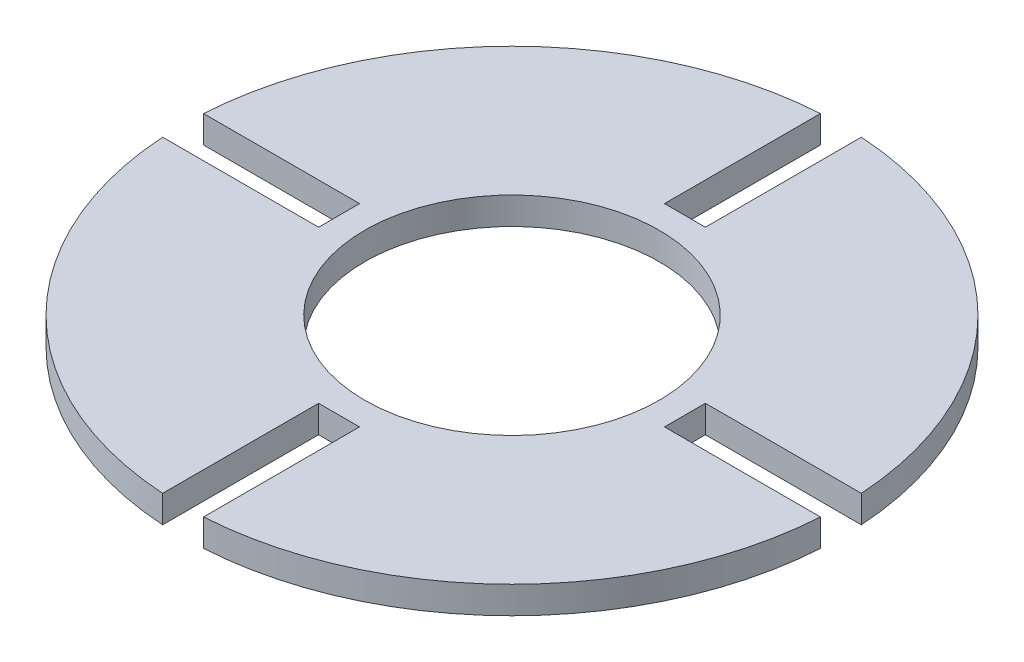
ISO-10303-21;
HEADER;
FILE_DESCRIPTION(('STEP AP214'),'2;1');
FILE_NAME('part.step','',(''),(''),'','','');
FILE_SCHEMA(('AUTOMOTIVE_DESIGN { 1 0 10303 214 1 1 1 1 }'));
ENDSEC;
DATA;
#1=APPLICATION_CONTEXT('core data for automotive mechanical design processes');
#2=APPLICATION_PROTOCOL_DEFINITION('international standard','automotive_design',2000,#1);
#3=PRODUCT_CONTEXT('',#1,'mechanical');
#4=PRODUCT('Part','Part','',(#3));
#5=PRODUCT_RELATED_PRODUCT_CATEGORY('part','',(#4));
#6=PRODUCT_DEFINITION_FORMATION('','',#4);
#7=PRODUCT_DEFINITION_CONTEXT('part definition',#1,'design');
#8=PRODUCT_DEFINITION('design','',#6,#7);
#9=PRODUCT_DEFINITION_SHAPE('','',#8);
#10=(LENGTH_UNIT() NAMED_UNIT(*) SI_UNIT(.MILLI.,.METRE.));
#11=(NAMED_UNIT(*) PLANE_ANGLE_UNIT() SI_UNIT($,.RADIAN.));
#12=(NAMED_UNIT(*) SI_UNIT($,.STERADIAN.) SOLID_ANGLE_UNIT());
#13=UNCERTAINTY_MEASURE_WITH_UNIT(LENGTH_MEASURE(1.E-05),#10,'distance_accuracy_value','');
#14=(GEOMETRIC_REPRESENTATION_CONTEXT(3) GLOBAL_UNCERTAINTY_ASSIGNED_CONTEXT((#13)) GLOBAL_UNIT_ASSIGNED_CONTEXT((#10,
#11,#12)) REPRESENTATION_CONTEXT('',''));
#15=CARTESIAN_POINT('',(0.,0.,0.));
#16=DIRECTION('',(0.,0.,1.));
#17=DIRECTION('',(1.,0.,0.));
#18=AXIS2_PLACEMENT_3D('',#15,#16,#17);
#19=CARTESIAN_POINT('',(0.,2.,0.));
#20=DIRECTION('',(0.,1.,0.));
#21=DIRECTION('',(0.,0.,1.));
#22=AXIS2_PLACEMENT_3D('',#19,#20,#21);
#23=PLANE('',#22);
#24=CARTESIAN_POINT('',(0.,2.,0.));
#25=DIRECTION('',(0.,1.,0.));
#26=DIRECTION('',(0.,0.,1.));
#27=AXIS2_PLACEMENT_3D('',#24,#25,#26);
#28=CIRCLE('',#27,24.15);
#29=CARTESIAN_POINT('',(-1.5,2.,-24.1033711335157));
#30=VERTEX_POINT('',#29);
#31=CARTESIAN_POINT('',(-24.1033711335157,2.,-1.5));
#32=VERTEX_POINT('',#31);
#33=EDGE_CURVE('E236',#30,#32,#28,.T.);
#34=ORIENTED_EDGE('',*,*,#33,.T.);
#35=DIRECTION('',(1.,0.,0.));
#36=VECTOR('',#35,1.);
#37=CARTESIAN_POINT('',(-12.6733711335157,2.,-1.5));
#38=LINE('',#37,#36);
#39=CARTESIAN_POINT('',(-12.6733711335157,2.,-1.5));
#40=VERTEX_POINT('',#39);
#41=EDGE_CURVE('E124',#32,#40,#38,.T.);
#42=ORIENTED_EDGE('',*,*,#41,.T.);
#43=DIRECTION('',(0.,0.,1.));
#44=VECTOR('',#43,1.);
#45=CARTESIAN_POINT('',(-12.6733711335157,2.,1.5));
#46=LINE('',#45,#44);
#47=CARTESIAN_POINT('',(-12.6733711335157,2.,1.5));
#48=VERTEX_POINT('',#47);
#49=EDGE_CURVE('E289',#40,#48,#46,.T.);
#50=ORIENTED_EDGE('',*,*,#49,.T.);
#51=DIRECTION('',(-1.,0.,0.));
#52=VECTOR('',#51,1.);
#53=CARTESIAN_POINT('',(-24.1033711335157,2.,1.50000000000001));
#54=LINE('',#53,#52);
#55=CARTESIAN_POINT('',(-24.1033711335157,2.,1.5));
#56=VERTEX_POINT('',#55);
#57=EDGE_CURVE('E309',#48,#56,#54,.T.);
#58=ORIENTED_EDGE('',*,*,#57,.T.);
#59=CARTESIAN_POINT('',(0.,2.,0.));
#60=DIRECTION('',(0.,1.,0.));
#61=DIRECTION('',(0.,0.,1.));
#62=AXIS2_PLACEMENT_3D('',#59,#60,#61);
#63=CIRCLE('',#62,24.15);
#64=CARTESIAN_POINT('',(-1.5,2.,24.1033711335157));
#65=VERTEX_POINT('',#64);
#66=EDGE_CURVE('E305',#56,#65,#63,.T.);
#67=ORIENTED_EDGE('',*,*,#66,.T.);
#68=DIRECTION('',(0.,0.,-1.));
#69=VECTOR('',#68,1.);
#70=CARTESIAN_POINT('',(-1.5,2.,12.6733711335157));
#71=LINE('',#70,#69);
#72=CARTESIAN_POINT('',(-1.5,2.,12.6733711335157));
#73=VERTEX_POINT('',#72);
#74=EDGE_CURVE('E308',#65,#73,#71,.T.);
#75=ORIENTED_EDGE('',*,*,#74,.T.);
#76=DIRECTION('',(1.,0.,0.));
#77=VECTOR('',#76,1.);
#78=CARTESIAN_POINT('',(1.5,2.,12.6733711335157));
#79=LINE('',#78,#77);
#80=CARTESIAN_POINT('',(1.5,2.,12.6733711335157));
#81=VERTEX_POINT('',#80);
#82=EDGE_CURVE('E313',#73,#81,#79,.T.);
#83=ORIENTED_EDGE('',*,*,#82,.T.);
#84=DIRECTION('',(0.,0.,1.));
#85=VECTOR('',#84,1.);
#86=CARTESIAN_POINT('',(1.5,2.,24.1033711335157));
#87=LINE('',#86,#85);
#88=CARTESIAN_POINT('',(1.5,2.,24.1033711335157));
#89=VERTEX_POINT('',#88);
#90=EDGE_CURVE('E320',#81,#89,#87,.T.);
#91=ORIENTED_EDGE('',*,*,#90,.T.);
#92=CARTESIAN_POINT('',(0.,2.,0.));
#93=DIRECTION('',(0.,1.,0.));
#94=DIRECTION('',(0.,0.,1.));
#95=AXIS2_PLACEMENT_3D('',#92,#93,#94);
#96=CIRCLE('',#95,24.15);
#97=CARTESIAN_POINT('',(24.1033711335157,2.,1.5));
#98=VERTEX_POINT('',#97);
#99=EDGE_CURVE('E323',#89,#98,#96,.T.);
#100=ORIENTED_EDGE('',*,*,#99,.T.);
#101=DIRECTION('',(-1.,0.,0.));
#102=VECTOR('',#101,1.);
#103=CARTESIAN_POINT('',(12.6733711335157,2.,1.5));
#104=LINE('',#103,#102);
#105=CARTESIAN_POINT('',(12.6733711335157,2.,1.5));
#106=VERTEX_POINT('',#105);
#107=EDGE_CURVE('E326',#98,#106,#104,.T.);
#108=ORIENTED_EDGE('',*,*,#107,.T.);
#109=DIRECTION('',(0.,0.,-1.));
#110=VECTOR('',#109,1.);
#111=CARTESIAN_POINT('',(12.6733711335157,2.,-1.5));
#112=LINE('',#111,#110);
#113=CARTESIAN_POINT('',(12.6733711335157,2.,-1.5));
#114=VERTEX_POINT('',#113);
#115=EDGE_CURVE('E329',#106,#114,#112,.T.);
#116=ORIENTED_EDGE('',*,*,#115,.T.);
#117=DIRECTION('',(1.,0.,0.));
#118=VECTOR('',#117,1.);
#119=CARTESIAN_POINT('',(24.1033711335157,2.,-1.5));
#120=LINE('',#119,#118);
#121=CARTESIAN_POINT('',(24.1033711335157,2.,-1.5));
#122=VERTEX_POINT('',#121);
#123=EDGE_CURVE('E332',#114,#122,#120,.T.);
#124=ORIENTED_EDGE('',*,*,#123,.T.);
#125=CARTESIAN_POINT('',(0.,2.,0.));
#126=DIRECTION('',(0.,1.,0.));
#127=DIRECTION('',(0.,0.,1.));
#128=AXIS2_PLACEMENT_3D('',#125,#126,#127);
#129=CIRCLE('',#128,24.15);
#130=CARTESIAN_POINT('',(1.5,2.,-24.1033711335157));
#131=VERTEX_POINT('',#130);
#132=EDGE_CURVE('E167',#122,#131,#129,.T.);
#133=ORIENTED_EDGE('',*,*,#132,.T.);
#134=DIRECTION('',(0.,0.,1.));
#135=VECTOR('',#134,1.);
#136=CARTESIAN_POINT('',(1.5,2.,-12.6733711335157));
#137=LINE('',#136,#135);
#138=CARTESIAN_POINT('',(1.5,2.,-12.6733711335157));
#139=VERTEX_POINT('',#138);
#140=EDGE_CURVE('E161',#131,#139,#137,.T.);
#141=ORIENTED_EDGE('',*,*,#140,.T.);
#142=DIRECTION('',(-1.,0.,0.));
#143=VECTOR('',#142,1.);
#144=CARTESIAN_POINT('',(-1.5,2.,-12.6733711335157));
#145=LINE('',#144,#143);
#146=CARTESIAN_POINT('',(-1.5,2.,-12.6733711335157));
#147=VERTEX_POINT('',#146);
#148=EDGE_CURVE('E165',#139,#147,#145,.T.);
#149=ORIENTED_EDGE('',*,*,#148,.T.);
#150=DIRECTION('',(0.,0.,-1.));
#151=VECTOR('',#150,1.);
#152=CARTESIAN_POINT('',(-1.5,2.,-24.1033711335157));
#153=LINE('',#152,#151);
#154=EDGE_CURVE('E57',#147,#30,#153,.T.);
#155=ORIENTED_EDGE('',*,*,#154,.T.);
#156=EDGE_LOOP('',(#34,#42,#50,#58,#67,#75,#83,#91,#100,#108,#116,#124,#133,#141,#149,#155));
#157=FACE_BOUND('',#156,.T.);
#158=CARTESIAN_POINT('',(0.,2.,0.));
#159=DIRECTION('',(0.,1.,0.));
#160=DIRECTION('',(0.,0.,1.));
#161=AXIS2_PLACEMENT_3D('',#158,#159,#160);
#162=CIRCLE('',#161,10.795);
#163=CARTESIAN_POINT('',(0.,2.,10.795));
#164=VERTEX_POINT('',#163);
#165=EDGE_CURVE('E194',#164,#164,#162,.T.);
#166=ORIENTED_EDGE('',*,*,#165,.F.);
#167=EDGE_LOOP('',(#166));
#168=FACE_BOUND('',#167,.T.);
#169=ADVANCED_FACE('F39',(#157,#168),#23,.T.);
#170=CARTESIAN_POINT('',(0.,0.,0.));
#171=DIRECTION('',(0.,1.,0.));
#172=DIRECTION('',(0.,0.,1.));
#173=AXIS2_PLACEMENT_3D('',#170,#171,#172);
#174=PLANE('',#173);
#175=CARTESIAN_POINT('',(0.,0.,0.));
#176=DIRECTION('',(0.,1.,0.));
#177=DIRECTION('',(0.,0.,1.));
#178=AXIS2_PLACEMENT_3D('',#175,#176,#177);
#179=CIRCLE('',#178,24.15);
#180=CARTESIAN_POINT('',(-1.5,0.,-24.1033711335157));
#181=VERTEX_POINT('',#180);
#182=CARTESIAN_POINT('',(-24.1033711335157,0.,-1.5));
#183=VERTEX_POINT('',#182);
#184=EDGE_CURVE('E189',#181,#183,#179,.T.);
#185=ORIENTED_EDGE('',*,*,#184,.F.);
#186=DIRECTION('',(0.,0.,-1.));
#187=VECTOR('',#186,1.);
#188=CARTESIAN_POINT('',(-1.5,0.,-24.1033711335157));
#189=LINE('',#188,#187);
#190=CARTESIAN_POINT('',(-1.5,0.,-12.6733711335157));
#191=VERTEX_POINT('',#190);
#192=EDGE_CURVE('E116',#191,#181,#189,.T.);
#193=ORIENTED_EDGE('',*,*,#192,.F.);
#194=DIRECTION('',(-1.,0.,0.));
#195=VECTOR('',#194,1.);
#196=CARTESIAN_POINT('',(-1.5,0.,-12.6733711335157));
#197=LINE('',#196,#195);
#198=CARTESIAN_POINT('',(1.5,0.,-12.6733711335157));
#199=VERTEX_POINT('',#198);
#200=EDGE_CURVE('E110',#199,#191,#197,.T.);
#201=ORIENTED_EDGE('',*,*,#200,.F.);
#202=DIRECTION('',(0.,0.,1.));
#203=VECTOR('',#202,1.);
#204=CARTESIAN_POINT('',(1.5,0.,-12.6733711335157));
#205=LINE('',#204,#203);
#206=CARTESIAN_POINT('',(1.5,0.,-24.1033711335157));
#207=VERTEX_POINT('',#206);
#208=EDGE_CURVE('E176',#207,#199,#205,.T.);
#209=ORIENTED_EDGE('',*,*,#208,.F.);
#210=CARTESIAN_POINT('',(0.,0.,0.));
#211=DIRECTION('',(0.,1.,0.));
#212=DIRECTION('',(0.,0.,1.));
#213=AXIS2_PLACEMENT_3D('',#210,#211,#212);
#214=CIRCLE('',#213,24.15);
#215=CARTESIAN_POINT('',(24.1033711335157,0.,-1.5));
#216=VERTEX_POINT('',#215);
#217=EDGE_CURVE('E227',#216,#207,#214,.T.);
#218=ORIENTED_EDGE('',*,*,#217,.F.);
#219=DIRECTION('',(1.,0.,0.));
#220=VECTOR('',#219,1.);
#221=CARTESIAN_POINT('',(24.1033711335157,0.,-1.5));
#222=LINE('',#221,#220);
#223=CARTESIAN_POINT('',(12.6733711335157,0.,-1.5));
#224=VERTEX_POINT('',#223);
#225=EDGE_CURVE('E224',#224,#216,#222,.T.);
#226=ORIENTED_EDGE('',*,*,#225,.F.);
#227=DIRECTION('',(0.,0.,-1.));
#228=VECTOR('',#227,1.);
#229=CARTESIAN_POINT('',(12.6733711335157,0.,-1.5));
#230=LINE('',#229,#228);
#231=CARTESIAN_POINT('',(12.6733711335157,0.,1.5));
#232=VERTEX_POINT('',#231);
#233=EDGE_CURVE('E221',#232,#224,#230,.T.);
#234=ORIENTED_EDGE('',*,*,#233,.F.);
#235=DIRECTION('',(-1.,0.,0.));
#236=VECTOR('',#235,1.);
#237=CARTESIAN_POINT('',(12.6733711335157,0.,1.5));
#238=LINE('',#237,#236);
#239=CARTESIAN_POINT('',(24.1033711335157,0.,1.5));
#240=VERTEX_POINT('',#239);
#241=EDGE_CURVE('E218',#240,#232,#238,.T.);
#242=ORIENTED_EDGE('',*,*,#241,.F.);
#243=CARTESIAN_POINT('',(0.,0.,0.));
#244=DIRECTION('',(0.,1.,0.));
#245=DIRECTION('',(0.,0.,1.));
#246=AXIS2_PLACEMENT_3D('',#243,#244,#245);
#247=CIRCLE('',#246,24.15);
#248=CARTESIAN_POINT('',(1.5,0.,24.1033711335157));
#249=VERTEX_POINT('',#248);
#250=EDGE_CURVE('E215',#249,#240,#247,.T.);
#251=ORIENTED_EDGE('',*,*,#250,.F.);
#252=DIRECTION('',(0.,0.,1.));
#253=VECTOR('',#252,1.);
#254=CARTESIAN_POINT('',(1.5,0.,24.1033711335157));
#255=LINE('',#254,#253);
#256=CARTESIAN_POINT('',(1.5,0.,12.6733711335157));
#257=VERTEX_POINT('',#256);
#258=EDGE_CURVE('E212',#257,#249,#255,.T.);
#259=ORIENTED_EDGE('',*,*,#258,.F.);
#260=DIRECTION('',(1.,0.,0.));
#261=VECTOR('',#260,1.);
#262=CARTESIAN_POINT('',(1.5,0.,12.6733711335157));
#263=LINE('',#262,#261);
#264=CARTESIAN_POINT('',(-1.5,0.,12.6733711335157));
#265=VERTEX_POINT('',#264);
#266=EDGE_CURVE('E209',#265,#257,#263,.T.);
#267=ORIENTED_EDGE('',*,*,#266,.F.);
#268=DIRECTION('',(0.,0.,-1.));
#269=VECTOR('',#268,1.);
#270=CARTESIAN_POINT('',(-1.5,0.,12.6733711335157));
#271=LINE('',#270,#269);
#272=CARTESIAN_POINT('',(-1.5,0.,24.1033711335157));
#273=VERTEX_POINT('',#272);
#274=EDGE_CURVE('E206',#273,#265,#271,.T.);
#275=ORIENTED_EDGE('',*,*,#274,.F.);
#276=CARTESIAN_POINT('',(0.,0.,0.));
#277=DIRECTION('',(0.,1.,0.));
#278=DIRECTION('',(0.,0.,1.));
#279=AXIS2_PLACEMENT_3D('',#276,#277,#278);
#280=CIRCLE('',#279,24.15);
#281=CARTESIAN_POINT('',(-24.1033711335157,0.,1.5));
#282=VERTEX_POINT('',#281);
#283=EDGE_CURVE('E203',#282,#273,#280,.T.);
#284=ORIENTED_EDGE('',*,*,#283,.F.);
#285=DIRECTION('',(-1.,0.,0.));
#286=VECTOR('',#285,1.);
#287=CARTESIAN_POINT('',(-24.1033711335157,0.,1.50000000000001));
#288=LINE('',#287,#286);
#289=CARTESIAN_POINT('',(-12.6733711335157,0.,1.5));
#290=VERTEX_POINT('',#289);
#291=EDGE_CURVE('E200',#290,#282,#288,.T.);
#292=ORIENTED_EDGE('',*,*,#291,.F.);
#293=DIRECTION('',(0.,0.,1.));
#294=VECTOR('',#293,1.);
#295=CARTESIAN_POINT('',(-12.6733711335157,0.,1.5));
#296=LINE('',#295,#294);
#297=CARTESIAN_POINT('',(-12.6733711335157,0.,-1.5));
#298=VERTEX_POINT('',#297);
#299=EDGE_CURVE('E197',#298,#290,#296,.T.);
#300=ORIENTED_EDGE('',*,*,#299,.F.);
#301=DIRECTION('',(1.,0.,0.));
#302=VECTOR('',#301,1.);
#303=CARTESIAN_POINT('',(-12.6733711335157,0.,-1.5));
#304=LINE('',#303,#302);
#305=EDGE_CURVE('E193',#183,#298,#304,.T.);
#306=ORIENTED_EDGE('',*,*,#305,.F.);
#307=EDGE_LOOP('',(#185,#193,#201,#209,#218,#226,#234,#242,#251,#259,#267,#275,#284,#292,#300,#306));
#308=FACE_BOUND('',#307,.T.);
#309=CARTESIAN_POINT('',(0.,0.,0.));
#310=DIRECTION('',(0.,1.,0.));
#311=DIRECTION('',(0.,0.,1.));
#312=AXIS2_PLACEMENT_3D('',#309,#310,#311);
#313=CIRCLE('',#312,10.795);
#314=CARTESIAN_POINT('',(0.,0.,10.795));
#315=VERTEX_POINT('',#314);
#316=EDGE_CURVE('E533',#315,#315,#313,.T.);
#317=ORIENTED_EDGE('',*,*,#316,.T.);
#318=EDGE_LOOP('',(#317));
#319=FACE_BOUND('',#318,.T.);
#320=ADVANCED_FACE('F293',(#308,#319),#174,.F.);
#321=CARTESIAN_POINT('',(0.,2.,0.));
#322=DIRECTION('',(0.,-1.,0.));
#323=DIRECTION('',(0.,0.,-1.));
#324=AXIS2_PLACEMENT_3D('',#321,#322,#323);
#325=CYLINDRICAL_SURFACE('',#324,24.15);
#326=ORIENTED_EDGE('',*,*,#184,.T.);
#327=DIRECTION('',(0.,-1.,0.));
#328=VECTOR('',#327,1.);
#329=CARTESIAN_POINT('',(-24.1033711335157,2.,-1.5));
#330=LINE('',#329,#328);
#331=EDGE_CURVE('E11',#32,#183,#330,.T.);
#332=ORIENTED_EDGE('',*,*,#331,.F.);
#333=ORIENTED_EDGE('',*,*,#33,.F.);
#334=DIRECTION('',(0.,-1.,0.));
#335=VECTOR('',#334,1.);
#336=CARTESIAN_POINT('',(-1.5,2.,-24.1033711335157));
#337=LINE('',#336,#335);
#338=EDGE_CURVE('E185',#30,#181,#337,.T.);
#339=ORIENTED_EDGE('',*,*,#338,.T.);
#340=EDGE_LOOP('',(#326,#332,#333,#339));
#341=FACE_BOUND('',#340,.T.);
#342=ADVANCED_FACE('F41',(#341),#325,.T.);
#343=CARTESIAN_POINT('',(-12.6733711335157,2.,-1.5));
#344=DIRECTION('',(0.,0.,-1.));
#345=DIRECTION('',(-1.,0.,0.));
#346=AXIS2_PLACEMENT_3D('',#343,#344,#345);
#347=PLANE('',#346);
#348=ORIENTED_EDGE('',*,*,#305,.T.);
#349=DIRECTION('',(0.,-1.,0.));
#350=VECTOR('',#349,1.);
#351=CARTESIAN_POINT('',(-12.6733711335157,2.,-1.5));
#352=LINE('',#351,#350);
#353=EDGE_CURVE('E49',#40,#298,#352,.T.);
#354=ORIENTED_EDGE('',*,*,#353,.F.);
#355=ORIENTED_EDGE('',*,*,#41,.F.);
#356=ORIENTED_EDGE('',*,*,#331,.T.);
#357=EDGE_LOOP('',(#348,#354,#355,#356));
#358=FACE_BOUND('',#357,.T.);
#359=ADVANCED_FACE('F368',(#358),#347,.F.);
#360=CARTESIAN_POINT('',(-12.6733711335157,2.,1.5));
#361=DIRECTION('',(1.,0.,0.));
#362=DIRECTION('',(0.,0.,-1.));
#363=AXIS2_PLACEMENT_3D('',#360,#361,#362);
#364=PLANE('',#363);
#365=ORIENTED_EDGE('',*,*,#299,.T.);
#366=DIRECTION('',(0.,-1.,0.));
#367=VECTOR('',#366,1.);
#368=CARTESIAN_POINT('',(-12.6733711335157,2.,1.5));
#369=LINE('',#368,#367);
#370=EDGE_CURVE('E279',#48,#290,#369,.T.);
#371=ORIENTED_EDGE('',*,*,#370,.F.);
#372=ORIENTED_EDGE('',*,*,#49,.F.);
#373=ORIENTED_EDGE('',*,*,#353,.T.);
#374=EDGE_LOOP('',(#365,#371,#372,#373));
#375=FACE_BOUND('',#374,.T.);
#376=ADVANCED_FACE('F287',(#375),#364,.F.);
#377=CARTESIAN_POINT('',(-24.1033711335157,2.,1.50000000000001));
#378=DIRECTION('',(0.,0.,1.));
#379=DIRECTION('',(1.,0.,0.));
#380=AXIS2_PLACEMENT_3D('',#377,#378,#379);
#381=PLANE('',#380);
#382=ORIENTED_EDGE('',*,*,#291,.T.);
#383=DIRECTION('',(0.,-1.,0.));
#384=VECTOR('',#383,1.);
#385=CARTESIAN_POINT('',(-24.1033711335157,2.,1.5));
#386=LINE('',#385,#384);
#387=EDGE_CURVE('E275',#56,#282,#386,.T.);
#388=ORIENTED_EDGE('',*,*,#387,.F.);
#389=ORIENTED_EDGE('',*,*,#57,.F.);
#390=ORIENTED_EDGE('',*,*,#370,.T.);
#391=EDGE_LOOP('',(#382,#388,#389,#390));
#392=FACE_BOUND('',#391,.T.);
#393=ADVANCED_FACE('F299',(#392),#381,.F.);
#394=CARTESIAN_POINT('',(0.,2.,0.));
#395=DIRECTION('',(0.,-1.,0.));
#396=DIRECTION('',(0.,0.,-1.));
#397=AXIS2_PLACEMENT_3D('',#394,#395,#396);
#398=CYLINDRICAL_SURFACE('',#397,24.15);
#399=ORIENTED_EDGE('',*,*,#283,.T.);
#400=DIRECTION('',(0.,-1.,0.));
#401=VECTOR('',#400,1.);
#402=CARTESIAN_POINT('',(-1.5,2.,24.1033711335157));
#403=LINE('',#402,#401);
#404=EDGE_CURVE('E271',#65,#273,#403,.T.);
#405=ORIENTED_EDGE('',*,*,#404,.F.);
#406=ORIENTED_EDGE('',*,*,#66,.F.);
#407=ORIENTED_EDGE('',*,*,#387,.T.);
#408=EDGE_LOOP('',(#399,#405,#406,#407));
#409=FACE_BOUND('',#408,.T.);
#410=ADVANCED_FACE('F303',(#409),#398,.T.);
#411=CARTESIAN_POINT('',(-1.5,2.,12.6733711335157));
#412=DIRECTION('',(-1.,0.,0.));
#413=DIRECTION('',(0.,0.,1.));
#414=AXIS2_PLACEMENT_3D('',#411,#412,#413);
#415=PLANE('',#414);
#416=ORIENTED_EDGE('',*,*,#274,.T.);
#417=DIRECTION('',(0.,-1.,0.));
#418=VECTOR('',#417,1.);
#419=CARTESIAN_POINT('',(-1.5,2.,12.6733711335157));
#420=LINE('',#419,#418);
#421=EDGE_CURVE('E267',#73,#265,#420,.T.);
#422=ORIENTED_EDGE('',*,*,#421,.F.);
#423=ORIENTED_EDGE('',*,*,#74,.F.);
#424=ORIENTED_EDGE('',*,*,#404,.T.);
#425=EDGE_LOOP('',(#416,#422,#423,#424));
#426=FACE_BOUND('',#425,.T.);
#427=ADVANCED_FACE('F381',(#426),#415,.F.);
#428=CARTESIAN_POINT('',(1.5,2.,12.6733711335157));
#429=DIRECTION('',(0.,0.,-1.));
#430=DIRECTION('',(-1.,0.,0.));
#431=AXIS2_PLACEMENT_3D('',#428,#429,#430);
#432=PLANE('',#431);
#433=ORIENTED_EDGE('',*,*,#266,.T.);
#434=DIRECTION('',(0.,-1.,0.));
#435=VECTOR('',#434,1.);
#436=CARTESIAN_POINT('',(1.5,2.,12.6733711335157));
#437=LINE('',#436,#435);
#438=EDGE_CURVE('E263',#81,#257,#437,.T.);
#439=ORIENTED_EDGE('',*,*,#438,.F.);
#440=ORIENTED_EDGE('',*,*,#82,.F.);
#441=ORIENTED_EDGE('',*,*,#421,.T.);
#442=EDGE_LOOP('',(#433,#439,#440,#441));
#443=FACE_BOUND('',#442,.T.);
#444=ADVANCED_FACE('F384',(#443),#432,.F.);
#445=CARTESIAN_POINT('',(1.5,2.,24.1033711335157));
#446=DIRECTION('',(1.,0.,0.));
#447=DIRECTION('',(0.,0.,-1.));
#448=AXIS2_PLACEMENT_3D('',#445,#446,#447);
#449=PLANE('',#448);
#450=ORIENTED_EDGE('',*,*,#258,.T.);
#451=DIRECTION('',(0.,-1.,0.));
#452=VECTOR('',#451,1.);
#453=CARTESIAN_POINT('',(1.5,2.,24.1033711335157));
#454=LINE('',#453,#452);
#455=EDGE_CURVE('E259',#89,#249,#454,.T.);
#456=ORIENTED_EDGE('',*,*,#455,.F.);
#457=ORIENTED_EDGE('',*,*,#90,.F.);
#458=ORIENTED_EDGE('',*,*,#438,.T.);
#459=EDGE_LOOP('',(#450,#456,#457,#458));
#460=FACE_BOUND('',#459,.T.);
#461=ADVANCED_FACE('F388',(#460),#449,.F.);
#462=CARTESIAN_POINT('',(0.,2.,0.));
#463=DIRECTION('',(0.,-1.,0.));
#464=DIRECTION('',(0.,0.,-1.));
#465=AXIS2_PLACEMENT_3D('',#462,#463,#464);
#466=CYLINDRICAL_SURFACE('',#465,24.15);
#467=ORIENTED_EDGE('',*,*,#250,.T.);
#468=DIRECTION('',(0.,-1.,0.));
#469=VECTOR('',#468,1.);
#470=CARTESIAN_POINT('',(24.1033711335157,2.,1.5));
#471=LINE('',#470,#469);
#472=EDGE_CURVE('E255',#98,#240,#471,.T.);
#473=ORIENTED_EDGE('',*,*,#472,.F.);
#474=ORIENTED_EDGE('',*,*,#99,.F.);
#475=ORIENTED_EDGE('',*,*,#455,.T.);
#476=EDGE_LOOP('',(#467,#473,#474,#475));
#477=FACE_BOUND('',#476,.T.);
#478=ADVANCED_FACE('F392',(#477),#466,.T.);
#479=CARTESIAN_POINT('',(12.6733711335157,2.,1.5));
#480=DIRECTION('',(0.,0.,1.));
#481=DIRECTION('',(1.,0.,0.));
#482=AXIS2_PLACEMENT_3D('',#479,#480,#481);
#483=PLANE('',#482);
#484=ORIENTED_EDGE('',*,*,#241,.T.);
#485=DIRECTION('',(0.,-1.,0.));
#486=VECTOR('',#485,1.);
#487=CARTESIAN_POINT('',(12.6733711335157,2.,1.5));
#488=LINE('',#487,#486);
#489=EDGE_CURVE('E251',#106,#232,#488,.T.);
#490=ORIENTED_EDGE('',*,*,#489,.F.);
#491=ORIENTED_EDGE('',*,*,#107,.F.);
#492=ORIENTED_EDGE('',*,*,#472,.T.);
#493=EDGE_LOOP('',(#484,#490,#491,#492));
#494=FACE_BOUND('',#493,.T.);
#495=ADVANCED_FACE('F396',(#494),#483,.F.);
#496=CARTESIAN_POINT('',(12.6733711335157,2.,-1.5));
#497=DIRECTION('',(-1.,0.,0.));
#498=DIRECTION('',(0.,0.,1.));
#499=AXIS2_PLACEMENT_3D('',#496,#497,#498);
#500=PLANE('',#499);
#501=ORIENTED_EDGE('',*,*,#233,.T.);
#502=DIRECTION('',(0.,-1.,0.));
#503=VECTOR('',#502,1.);
#504=CARTESIAN_POINT('',(12.6733711335157,2.,-1.5));
#505=LINE('',#504,#503);
#506=EDGE_CURVE('E247',#114,#224,#505,.T.);
#507=ORIENTED_EDGE('',*,*,#506,.F.);
#508=ORIENTED_EDGE('',*,*,#115,.F.);
#509=ORIENTED_EDGE('',*,*,#489,.T.);
#510=EDGE_LOOP('',(#501,#507,#508,#509));
#511=FACE_BOUND('',#510,.T.);
#512=ADVANCED_FACE('F400',(#511),#500,.F.);
#513=CARTESIAN_POINT('',(24.1033711335157,2.,-1.5));
#514=DIRECTION('',(0.,0.,-1.));
#515=DIRECTION('',(-1.,0.,0.));
#516=AXIS2_PLACEMENT_3D('',#513,#514,#515);
#517=PLANE('',#516);
#518=ORIENTED_EDGE('',*,*,#225,.T.);
#519=DIRECTION('',(0.,-1.,0.));
#520=VECTOR('',#519,1.);
#521=CARTESIAN_POINT('',(24.1033711335157,2.,-1.5));
#522=LINE('',#521,#520);
#523=EDGE_CURVE('E243',#122,#216,#522,.T.);
#524=ORIENTED_EDGE('',*,*,#523,.F.);
#525=ORIENTED_EDGE('',*,*,#123,.F.);
#526=ORIENTED_EDGE('',*,*,#506,.T.);
#527=EDGE_LOOP('',(#518,#524,#525,#526));
#528=FACE_BOUND('',#527,.T.);
#529=ADVANCED_FACE('F340',(#528),#517,.F.);
#530=CARTESIAN_POINT('',(0.,2.,0.));
#531=DIRECTION('',(0.,-1.,0.));
#532=DIRECTION('',(0.,0.,-1.));
#533=AXIS2_PLACEMENT_3D('',#530,#531,#532);
#534=CYLINDRICAL_SURFACE('',#533,24.15);
#535=ORIENTED_EDGE('',*,*,#217,.T.);
#536=DIRECTION('',(0.,-1.,0.));
#537=VECTOR('',#536,1.);
#538=CARTESIAN_POINT('',(1.5,2.,-24.1033711335157));
#539=LINE('',#538,#537);
#540=EDGE_CURVE('E178',#131,#207,#539,.T.);
#541=ORIENTED_EDGE('',*,*,#540,.F.);
#542=ORIENTED_EDGE('',*,*,#132,.F.);
#543=ORIENTED_EDGE('',*,*,#523,.T.);
#544=EDGE_LOOP('',(#535,#541,#542,#543));
#545=FACE_BOUND('',#544,.T.);
#546=ADVANCED_FACE('F344',(#545),#534,.T.);
#547=CARTESIAN_POINT('',(1.5,2.,-12.6733711335157));
#548=DIRECTION('',(1.,0.,0.));
#549=DIRECTION('',(0.,0.,-1.));
#550=AXIS2_PLACEMENT_3D('',#547,#548,#549);
#551=PLANE('',#550);
#552=ORIENTED_EDGE('',*,*,#208,.T.);
#553=DIRECTION('',(0.,-1.,0.));
#554=VECTOR('',#553,1.);
#555=CARTESIAN_POINT('',(1.5,2.,-12.6733711335157));
#556=LINE('',#555,#554);
#557=EDGE_CURVE('E173',#139,#199,#556,.T.);
#558=ORIENTED_EDGE('',*,*,#557,.F.);
#559=ORIENTED_EDGE('',*,*,#140,.F.);
#560=ORIENTED_EDGE('',*,*,#540,.T.);
#561=EDGE_LOOP('',(#552,#558,#559,#560));
#562=FACE_BOUND('',#561,.T.);
#563=ADVANCED_FACE('F174',(#562),#551,.F.);
#564=CARTESIAN_POINT('',(-1.5,2.,-12.6733711335157));
#565=DIRECTION('',(0.,0.,1.));
#566=DIRECTION('',(1.,0.,0.));
#567=AXIS2_PLACEMENT_3D('',#564,#565,#566);
#568=PLANE('',#567);
#569=ORIENTED_EDGE('',*,*,#200,.T.);
#570=DIRECTION('',(0.,-1.,0.));
#571=VECTOR('',#570,1.);
#572=CARTESIAN_POINT('',(-1.5,2.,-12.6733711335157));
#573=LINE('',#572,#571);
#574=EDGE_CURVE('E179',#147,#191,#573,.T.);
#575=ORIENTED_EDGE('',*,*,#574,.F.);
#576=ORIENTED_EDGE('',*,*,#148,.F.);
#577=ORIENTED_EDGE('',*,*,#557,.T.);
#578=EDGE_LOOP('',(#569,#575,#576,#577));
#579=FACE_BOUND('',#578,.T.);
#580=ADVANCED_FACE('F181',(#579),#568,.F.);
#581=CARTESIAN_POINT('',(-1.5,2.,-24.1033711335157));
#582=DIRECTION('',(-1.,0.,0.));
#583=DIRECTION('',(0.,0.,1.));
#584=AXIS2_PLACEMENT_3D('',#581,#582,#583);
#585=PLANE('',#584);
#586=ORIENTED_EDGE('',*,*,#192,.T.);
#587=ORIENTED_EDGE('',*,*,#338,.F.);
#588=ORIENTED_EDGE('',*,*,#154,.F.);
#589=ORIENTED_EDGE('',*,*,#574,.T.);
#590=EDGE_LOOP('',(#586,#587,#588,#589));
#591=FACE_BOUND('',#590,.T.);
#592=ADVANCED_FACE('F348',(#591),#585,.F.);
#593=CARTESIAN_POINT('',(0.,2.,0.));
#594=DIRECTION('',(0.,-1.,0.));
#595=DIRECTION('',(0.,0.,-1.));
#596=AXIS2_PLACEMENT_3D('',#593,#594,#595);
#597=CYLINDRICAL_SURFACE('',#596,10.795);
#598=ORIENTED_EDGE('',*,*,#165,.T.);
#599=EDGE_LOOP('',(#598));
#600=FACE_BOUND('',#599,.T.);
#601=ORIENTED_EDGE('',*,*,#316,.F.);
#602=EDGE_LOOP('',(#601));
#603=FACE_BOUND('',#602,.T.);
#604=ADVANCED_FACE('F350',(#600,#603),#597,.F.);
#605=CLOSED_SHELL('',(#169,#320,#342,#359,#376,#393,#410,#427,#444,#461,#478,#495,#512,#529,
#546,#563,#580,#592,#604));
#606=MANIFOLD_SOLID_BREP('B2',#605);
#607=ADVANCED_BREP_SHAPE_REPRESENTATION('',(#18,#606),#14);
#608=SHAPE_DEFINITION_REPRESENTATION(#9,#607);
ENDSEC;
END-ISO-10303-21;
